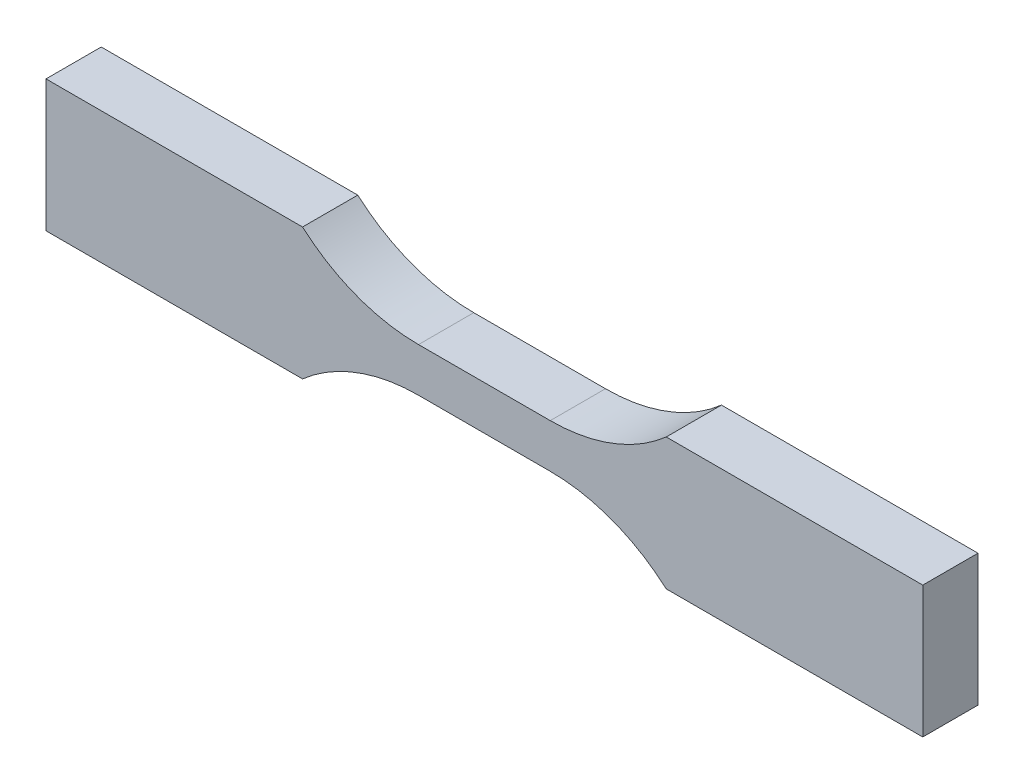
ISO-10303-21;
HEADER;
FILE_DESCRIPTION(('STEP AP214'),'2;1');
FILE_NAME('part.step','',(''),(''),'','','');
FILE_SCHEMA(('AUTOMOTIVE_DESIGN { 1 0 10303 214 1 1 1 1 }'));
ENDSEC;
DATA;
#1=APPLICATION_CONTEXT('core data for automotive mechanical design processes');
#2=APPLICATION_PROTOCOL_DEFINITION('international standard','automotive_design',2000,#1);
#3=PRODUCT_CONTEXT('',#1,'mechanical');
#4=PRODUCT('Part','Part','',(#3));
#5=PRODUCT_RELATED_PRODUCT_CATEGORY('part','',(#4));
#6=PRODUCT_DEFINITION_FORMATION('','',#4);
#7=PRODUCT_DEFINITION_CONTEXT('part definition',#1,'design');
#8=PRODUCT_DEFINITION('design','',#6,#7);
#9=PRODUCT_DEFINITION_SHAPE('','',#8);
#10=(LENGTH_UNIT() NAMED_UNIT(*) SI_UNIT(.MILLI.,.METRE.));
#11=(NAMED_UNIT(*) PLANE_ANGLE_UNIT() SI_UNIT($,.RADIAN.));
#12=(NAMED_UNIT(*) SI_UNIT($,.STERADIAN.) SOLID_ANGLE_UNIT());
#13=UNCERTAINTY_MEASURE_WITH_UNIT(LENGTH_MEASURE(1.E-05),#10,'distance_accuracy_value','');
#14=(GEOMETRIC_REPRESENTATION_CONTEXT(3) GLOBAL_UNCERTAINTY_ASSIGNED_CONTEXT((#13)) GLOBAL_UNIT_ASSIGNED_CONTEXT((#10,
#11,#12)) REPRESENTATION_CONTEXT('',''));
#15=CARTESIAN_POINT('',(0.,0.,0.));
#16=DIRECTION('',(0.,0.,1.));
#17=DIRECTION('',(1.,0.,0.));
#18=AXIS2_PLACEMENT_3D('',#15,#16,#17);
#19=CARTESIAN_POINT('',(18.58,0.,2.));
#20=DIRECTION('',(0.,1.,0.));
#21=DIRECTION('',(0.,0.,1.));
#22=AXIS2_PLACEMENT_3D('',#19,#20,#21);
#23=PLANE('',#22);
#24=DIRECTION('',(1.,0.,0.));
#25=VECTOR('',#24,1.);
#26=CARTESIAN_POINT('',(18.58,0.,-2.));
#27=LINE('',#26,#25);
#28=CARTESIAN_POINT('',(0.,0.,-2.));
#29=VERTEX_POINT('',#28);
#30=CARTESIAN_POINT('',(18.58,0.,-2.));
#31=VERTEX_POINT('',#30);
#32=EDGE_CURVE('E153',#29,#31,#27,.T.);
#33=ORIENTED_EDGE('',*,*,#32,.T.);
#34=DIRECTION('',(0.,0.,-1.));
#35=VECTOR('',#34,1.);
#36=CARTESIAN_POINT('',(18.58,0.,2.));
#37=LINE('',#36,#35);
#38=CARTESIAN_POINT('',(18.58,0.,2.));
#39=VERTEX_POINT('',#38);
#40=EDGE_CURVE('E151',#39,#31,#37,.T.);
#41=ORIENTED_EDGE('',*,*,#40,.F.);
#42=DIRECTION('',(1.,0.,0.));
#43=VECTOR('',#42,1.);
#44=CARTESIAN_POINT('',(18.58,0.,2.));
#45=LINE('',#44,#43);
#46=CARTESIAN_POINT('',(0.,0.,2.));
#47=VERTEX_POINT('',#46);
#48=EDGE_CURVE('E133',#47,#39,#45,.T.);
#49=ORIENTED_EDGE('',*,*,#48,.F.);
#50=DIRECTION('',(0.,0.,-1.));
#51=VECTOR('',#50,1.);
#52=CARTESIAN_POINT('',(0.,0.,2.));
#53=LINE('',#52,#51);
#54=EDGE_CURVE('E210',#47,#29,#53,.T.);
#55=ORIENTED_EDGE('',*,*,#54,.T.);
#56=EDGE_LOOP('',(#33,#41,#49,#55));
#57=FACE_BOUND('',#56,.T.);
#58=ADVANCED_FACE('F45',(#57),#23,.F.);
#59=CARTESIAN_POINT('',(44.92,3.175,2.));
#60=DIRECTION('',(0.,1.,0.));
#61=DIRECTION('',(-1.,0.,0.));
#62=AXIS2_PLACEMENT_3D('',#59,#60,#61);
#63=PLANE('',#62);
#64=DIRECTION('',(1.,0.,0.));
#65=VECTOR('',#64,1.);
#66=CARTESIAN_POINT('',(44.92,3.175,-2.));
#67=LINE('',#66,#65);
#68=CARTESIAN_POINT('',(26.9802604126301,3.175,-2.));
#69=VERTEX_POINT('',#68);
#70=CARTESIAN_POINT('',(36.5197395873699,3.175,-2.));
#71=VERTEX_POINT('',#70);
#72=EDGE_CURVE('E218',#69,#71,#67,.T.);
#73=ORIENTED_EDGE('',*,*,#72,.T.);
#74=DIRECTION('',(0.,0.,1.));
#75=VECTOR('',#74,1.);
#76=CARTESIAN_POINT('',(36.5197395873699,3.175,2.));
#77=LINE('',#76,#75);
#78=CARTESIAN_POINT('',(36.5197395873699,3.175,2.));
#79=VERTEX_POINT('',#78);
#80=EDGE_CURVE('E258',#71,#79,#77,.T.);
#81=ORIENTED_EDGE('',*,*,#80,.T.);
#82=DIRECTION('',(1.,0.,0.));
#83=VECTOR('',#82,1.);
#84=CARTESIAN_POINT('',(44.92,3.175,2.));
#85=LINE('',#84,#83);
#86=CARTESIAN_POINT('',(26.9802604126301,3.175,2.));
#87=VERTEX_POINT('',#86);
#88=EDGE_CURVE('E146',#87,#79,#85,.T.);
#89=ORIENTED_EDGE('',*,*,#88,.F.);
#90=DIRECTION('',(0.,0.,-1.));
#91=VECTOR('',#90,1.);
#92=CARTESIAN_POINT('',(26.9802604126301,3.175,2.));
#93=LINE('',#92,#91);
#94=EDGE_CURVE('E156',#87,#69,#93,.T.);
#95=ORIENTED_EDGE('',*,*,#94,.T.);
#96=EDGE_LOOP('',(#73,#81,#89,#95));
#97=FACE_BOUND('',#96,.T.);
#98=ADVANCED_FACE('F282',(#97),#63,.F.);
#99=CARTESIAN_POINT('',(63.5,0.,2.));
#100=DIRECTION('',(0.,1.,0.));
#101=DIRECTION('',(-1.,0.,0.));
#102=AXIS2_PLACEMENT_3D('',#99,#100,#101);
#103=PLANE('',#102);
#104=DIRECTION('',(1.,0.,0.));
#105=VECTOR('',#104,1.);
#106=CARTESIAN_POINT('',(63.5,0.,-2.));
#107=LINE('',#106,#105);
#108=CARTESIAN_POINT('',(44.92,0.,-2.));
#109=VERTEX_POINT('',#108);
#110=CARTESIAN_POINT('',(63.5,0.,-2.));
#111=VERTEX_POINT('',#110);
#112=EDGE_CURVE('E222',#109,#111,#107,.T.);
#113=ORIENTED_EDGE('',*,*,#112,.T.);
#114=DIRECTION('',(0.,0.,-1.));
#115=VECTOR('',#114,1.);
#116=CARTESIAN_POINT('',(63.5,0.,2.));
#117=LINE('',#116,#115);
#118=CARTESIAN_POINT('',(63.5,0.,2.));
#119=VERTEX_POINT('',#118);
#120=EDGE_CURVE('E249',#119,#111,#117,.T.);
#121=ORIENTED_EDGE('',*,*,#120,.F.);
#122=DIRECTION('',(1.,0.,0.));
#123=VECTOR('',#122,1.);
#124=CARTESIAN_POINT('',(63.5,0.,2.));
#125=LINE('',#124,#123);
#126=CARTESIAN_POINT('',(44.92,0.,2.));
#127=VERTEX_POINT('',#126);
#128=EDGE_CURVE('E266',#127,#119,#125,.T.);
#129=ORIENTED_EDGE('',*,*,#128,.F.);
#130=DIRECTION('',(0.,0.,-1.));
#131=VECTOR('',#130,1.);
#132=CARTESIAN_POINT('',(44.92,0.,2.));
#133=LINE('',#132,#131);
#134=EDGE_CURVE('E157',#127,#109,#133,.T.);
#135=ORIENTED_EDGE('',*,*,#134,.T.);
#136=EDGE_LOOP('',(#113,#121,#129,#135));
#137=FACE_BOUND('',#136,.T.);
#138=ADVANCED_FACE('F272',(#137),#103,.F.);
#139=CARTESIAN_POINT('',(63.5,9.53,2.));
#140=DIRECTION('',(-1.,0.,0.));
#141=DIRECTION('',(0.,0.,1.));
#142=AXIS2_PLACEMENT_3D('',#139,#140,#141);
#143=PLANE('',#142);
#144=DIRECTION('',(0.,1.,0.));
#145=VECTOR('',#144,1.);
#146=CARTESIAN_POINT('',(63.5,9.53,-2.));
#147=LINE('',#146,#145);
#148=CARTESIAN_POINT('',(63.5,9.53,-2.));
#149=VERTEX_POINT('',#148);
#150=EDGE_CURVE('E225',#111,#149,#147,.T.);
#151=ORIENTED_EDGE('',*,*,#150,.T.);
#152=DIRECTION('',(0.,0.,-1.));
#153=VECTOR('',#152,1.);
#154=CARTESIAN_POINT('',(63.5,9.53,2.));
#155=LINE('',#154,#153);
#156=CARTESIAN_POINT('',(63.5,9.53,2.));
#157=VERTEX_POINT('',#156);
#158=EDGE_CURVE('E245',#157,#149,#155,.T.);
#159=ORIENTED_EDGE('',*,*,#158,.F.);
#160=DIRECTION('',(0.,1.,0.));
#161=VECTOR('',#160,1.);
#162=CARTESIAN_POINT('',(63.5,9.53,2.));
#163=LINE('',#162,#161);
#164=EDGE_CURVE('E276',#119,#157,#163,.T.);
#165=ORIENTED_EDGE('',*,*,#164,.F.);
#166=ORIENTED_EDGE('',*,*,#120,.T.);
#167=EDGE_LOOP('',(#151,#159,#165,#166));
#168=FACE_BOUND('',#167,.T.);
#169=ADVANCED_FACE('F297',(#168),#143,.F.);
#170=CARTESIAN_POINT('',(44.92,9.53,2.));
#171=DIRECTION('',(0.,-1.,0.));
#172=DIRECTION('',(0.,0.,-1.));
#173=AXIS2_PLACEMENT_3D('',#170,#171,#172);
#174=PLANE('',#173);
#175=DIRECTION('',(-1.,0.,0.));
#176=VECTOR('',#175,1.);
#177=CARTESIAN_POINT('',(44.92,9.53,-2.));
#178=LINE('',#177,#176);
#179=CARTESIAN_POINT('',(44.92,9.53,-2.));
#180=VERTEX_POINT('',#179);
#181=EDGE_CURVE('E194',#149,#180,#178,.T.);
#182=ORIENTED_EDGE('',*,*,#181,.T.);
#183=DIRECTION('',(0.,0.,-1.));
#184=VECTOR('',#183,1.);
#185=CARTESIAN_POINT('',(44.92,9.53,2.));
#186=LINE('',#185,#184);
#187=CARTESIAN_POINT('',(44.92,9.53,2.));
#188=VERTEX_POINT('',#187);
#189=EDGE_CURVE('E241',#188,#180,#186,.T.);
#190=ORIENTED_EDGE('',*,*,#189,.F.);
#191=DIRECTION('',(-1.,0.,0.));
#192=VECTOR('',#191,1.);
#193=CARTESIAN_POINT('',(44.92,9.53,2.));
#194=LINE('',#193,#192);
#195=EDGE_CURVE('E212',#157,#188,#194,.T.);
#196=ORIENTED_EDGE('',*,*,#195,.F.);
#197=ORIENTED_EDGE('',*,*,#158,.T.);
#198=EDGE_LOOP('',(#182,#190,#196,#197));
#199=FACE_BOUND('',#198,.T.);
#200=ADVANCED_FACE('F292',(#199),#174,.F.);
#201=CARTESIAN_POINT('',(18.58,6.355,2.));
#202=DIRECTION('',(0.,-1.,0.));
#203=DIRECTION('',(0.,0.,-1.));
#204=AXIS2_PLACEMENT_3D('',#201,#202,#203);
#205=PLANE('',#204);
#206=DIRECTION('',(-1.,0.,0.));
#207=VECTOR('',#206,1.);
#208=CARTESIAN_POINT('',(18.58,6.355,2.));
#209=LINE('',#208,#207);
#210=CARTESIAN_POINT('',(36.5197395873699,6.355,2.));
#211=VERTEX_POINT('',#210);
#212=CARTESIAN_POINT('',(26.9802604126301,6.355,2.));
#213=VERTEX_POINT('',#212);
#214=EDGE_CURVE('E201',#211,#213,#209,.T.);
#215=ORIENTED_EDGE('',*,*,#214,.F.);
#216=DIRECTION('',(0.,0.,-1.));
#217=VECTOR('',#216,1.);
#218=CARTESIAN_POINT('',(36.5197395873699,6.355,2.));
#219=LINE('',#218,#217);
#220=CARTESIAN_POINT('',(36.5197395873699,6.355,-2.));
#221=VERTEX_POINT('',#220);
#222=EDGE_CURVE('E167',#211,#221,#219,.T.);
#223=ORIENTED_EDGE('',*,*,#222,.T.);
#224=DIRECTION('',(-1.,0.,0.));
#225=VECTOR('',#224,1.);
#226=CARTESIAN_POINT('',(18.58,6.355,-2.));
#227=LINE('',#226,#225);
#228=CARTESIAN_POINT('',(26.9802604126301,6.355,-2.));
#229=VERTEX_POINT('',#228);
#230=EDGE_CURVE('E185',#221,#229,#227,.T.);
#231=ORIENTED_EDGE('',*,*,#230,.T.);
#232=DIRECTION('',(0.,0.,1.));
#233=VECTOR('',#232,1.);
#234=CARTESIAN_POINT('',(26.9802604126301,6.355,2.));
#235=LINE('',#234,#233);
#236=EDGE_CURVE('E61',#229,#213,#235,.T.);
#237=ORIENTED_EDGE('',*,*,#236,.T.);
#238=EDGE_LOOP('',(#215,#223,#231,#237));
#239=FACE_BOUND('',#238,.T.);
#240=ADVANCED_FACE('F191',(#239),#205,.F.);
#241=CARTESIAN_POINT('',(0.,9.53,2.));
#242=DIRECTION('',(0.,-1.,0.));
#243=DIRECTION('',(0.,0.,-1.));
#244=AXIS2_PLACEMENT_3D('',#241,#242,#243);
#245=PLANE('',#244);
#246=DIRECTION('',(-1.,0.,0.));
#247=VECTOR('',#246,1.);
#248=CARTESIAN_POINT('',(0.,9.53,-2.));
#249=LINE('',#248,#247);
#250=CARTESIAN_POINT('',(18.58,9.53,-2.));
#251=VERTEX_POINT('',#250);
#252=CARTESIAN_POINT('',(0.,9.53,-2.));
#253=VERTEX_POINT('',#252);
#254=EDGE_CURVE('E187',#251,#253,#249,.T.);
#255=ORIENTED_EDGE('',*,*,#254,.T.);
#256=DIRECTION('',(0.,0.,-1.));
#257=VECTOR('',#256,1.);
#258=CARTESIAN_POINT('',(0.,9.53,2.));
#259=LINE('',#258,#257);
#260=CARTESIAN_POINT('',(0.,9.53,2.));
#261=VERTEX_POINT('',#260);
#262=EDGE_CURVE('E205',#261,#253,#259,.T.);
#263=ORIENTED_EDGE('',*,*,#262,.F.);
#264=DIRECTION('',(-1.,0.,0.));
#265=VECTOR('',#264,1.);
#266=CARTESIAN_POINT('',(0.,9.53,2.));
#267=LINE('',#266,#265);
#268=CARTESIAN_POINT('',(18.58,9.53,2.));
#269=VERTEX_POINT('',#268);
#270=EDGE_CURVE('E199',#269,#261,#267,.T.);
#271=ORIENTED_EDGE('',*,*,#270,.F.);
#272=DIRECTION('',(0.,0.,-1.));
#273=VECTOR('',#272,1.);
#274=CARTESIAN_POINT('',(18.58,9.53,2.));
#275=LINE('',#274,#273);
#276=EDGE_CURVE('E197',#269,#251,#275,.T.);
#277=ORIENTED_EDGE('',*,*,#276,.T.);
#278=EDGE_LOOP('',(#255,#263,#271,#277));
#279=FACE_BOUND('',#278,.T.);
#280=ADVANCED_FACE('F203',(#279),#245,.F.);
#281=CARTESIAN_POINT('',(0.,0.,2.));
#282=DIRECTION('',(1.,0.,0.));
#283=DIRECTION('',(0.,0.,-1.));
#284=AXIS2_PLACEMENT_3D('',#281,#282,#283);
#285=PLANE('',#284);
#286=DIRECTION('',(0.,-1.,0.));
#287=VECTOR('',#286,1.);
#288=CARTESIAN_POINT('',(0.,0.,-2.));
#289=LINE('',#288,#287);
#290=EDGE_CURVE('E147',#253,#29,#289,.T.);
#291=ORIENTED_EDGE('',*,*,#290,.T.);
#292=ORIENTED_EDGE('',*,*,#54,.F.);
#293=DIRECTION('',(0.,-1.,0.));
#294=VECTOR('',#293,1.);
#295=CARTESIAN_POINT('',(0.,0.,2.));
#296=LINE('',#295,#294);
#297=EDGE_CURVE('E141',#261,#47,#296,.T.);
#298=ORIENTED_EDGE('',*,*,#297,.F.);
#299=ORIENTED_EDGE('',*,*,#262,.T.);
#300=EDGE_LOOP('',(#291,#292,#298,#299));
#301=FACE_BOUND('',#300,.T.);
#302=ADVANCED_FACE('F357',(#301),#285,.F.);
#303=CARTESIAN_POINT('',(0.,0.,2.));
#304=DIRECTION('',(0.,0.,-1.));
#305=DIRECTION('',(-1.,0.,0.));
#306=AXIS2_PLACEMENT_3D('',#303,#304,#305);
#307=PLANE('',#306);
#308=ORIENTED_EDGE('',*,*,#48,.T.);
#309=CARTESIAN_POINT('',(26.9802604126301,-9.525,2.));
#310=DIRECTION('',(0.,0.,-1.));
#311=DIRECTION('',(-1.,0.,0.));
#312=AXIS2_PLACEMENT_3D('',#309,#310,#311);
#313=CIRCLE('',#312,12.7);
#314=EDGE_CURVE('E138',#39,#87,#313,.T.);
#315=ORIENTED_EDGE('',*,*,#314,.T.);
#316=ORIENTED_EDGE('',*,*,#88,.T.);
#317=CARTESIAN_POINT('',(36.5197395873699,-9.525,2.));
#318=DIRECTION('',(0.,0.,-1.));
#319=DIRECTION('',(-1.,0.,0.));
#320=AXIS2_PLACEMENT_3D('',#317,#318,#319);
#321=CIRCLE('',#320,12.7);
#322=EDGE_CURVE('E169',#79,#127,#321,.T.);
#323=ORIENTED_EDGE('',*,*,#322,.T.);
#324=ORIENTED_EDGE('',*,*,#128,.T.);
#325=ORIENTED_EDGE('',*,*,#164,.T.);
#326=ORIENTED_EDGE('',*,*,#195,.T.);
#327=CARTESIAN_POINT('',(36.5197395873699,19.055,2.));
#328=DIRECTION('',(0.,0.,-1.));
#329=DIRECTION('',(-1.,0.,0.));
#330=AXIS2_PLACEMENT_3D('',#327,#328,#329);
#331=CIRCLE('',#330,12.7);
#332=EDGE_CURVE('E68',#188,#211,#331,.T.);
#333=ORIENTED_EDGE('',*,*,#332,.T.);
#334=ORIENTED_EDGE('',*,*,#214,.T.);
#335=CARTESIAN_POINT('',(26.9802604126301,19.055,2.));
#336=DIRECTION('',(0.,0.,-1.));
#337=DIRECTION('',(-1.,0.,0.));
#338=AXIS2_PLACEMENT_3D('',#335,#336,#337);
#339=CIRCLE('',#338,12.7);
#340=EDGE_CURVE('E11',#213,#269,#339,.T.);
#341=ORIENTED_EDGE('',*,*,#340,.T.);
#342=ORIENTED_EDGE('',*,*,#270,.T.);
#343=ORIENTED_EDGE('',*,*,#297,.T.);
#344=EDGE_LOOP('',(#308,#315,#316,#323,#324,#325,#326,#333,#334,#341,#342,#343));
#345=FACE_BOUND('',#344,.T.);
#346=ADVANCED_FACE('F135',(#345),#307,.F.);
#347=CARTESIAN_POINT('',(0.,0.,-2.));
#348=DIRECTION('',(0.,0.,-1.));
#349=DIRECTION('',(-1.,0.,0.));
#350=AXIS2_PLACEMENT_3D('',#347,#348,#349);
#351=PLANE('',#350);
#352=ORIENTED_EDGE('',*,*,#32,.F.);
#353=ORIENTED_EDGE('',*,*,#290,.F.);
#354=ORIENTED_EDGE('',*,*,#254,.F.);
#355=CARTESIAN_POINT('',(26.9802604126301,19.055,-2.));
#356=DIRECTION('',(0.,0.,-1.));
#357=DIRECTION('',(-1.,0.,0.));
#358=AXIS2_PLACEMENT_3D('',#355,#356,#357);
#359=CIRCLE('',#358,12.7);
#360=EDGE_CURVE('E54',#251,#229,#359,.F.);
#361=ORIENTED_EDGE('',*,*,#360,.T.);
#362=ORIENTED_EDGE('',*,*,#230,.F.);
#363=CARTESIAN_POINT('',(36.5197395873699,19.055,-2.));
#364=DIRECTION('',(0.,0.,-1.));
#365=DIRECTION('',(-1.,0.,0.));
#366=AXIS2_PLACEMENT_3D('',#363,#364,#365);
#367=CIRCLE('',#366,12.7);
#368=EDGE_CURVE('E176',#221,#180,#367,.F.);
#369=ORIENTED_EDGE('',*,*,#368,.T.);
#370=ORIENTED_EDGE('',*,*,#181,.F.);
#371=ORIENTED_EDGE('',*,*,#150,.F.);
#372=ORIENTED_EDGE('',*,*,#112,.F.);
#373=CARTESIAN_POINT('',(36.5197395873699,-9.525,-2.));
#374=DIRECTION('',(0.,0.,-1.));
#375=DIRECTION('',(-1.,0.,0.));
#376=AXIS2_PLACEMENT_3D('',#373,#374,#375);
#377=CIRCLE('',#376,12.7);
#378=EDGE_CURVE('E261',#109,#71,#377,.F.);
#379=ORIENTED_EDGE('',*,*,#378,.T.);
#380=ORIENTED_EDGE('',*,*,#72,.F.);
#381=CARTESIAN_POINT('',(26.9802604126301,-9.525,-2.));
#382=DIRECTION('',(0.,0.,-1.));
#383=DIRECTION('',(-1.,0.,0.));
#384=AXIS2_PLACEMENT_3D('',#381,#382,#383);
#385=CIRCLE('',#384,12.7);
#386=EDGE_CURVE('E163',#69,#31,#385,.F.);
#387=ORIENTED_EDGE('',*,*,#386,.T.);
#388=EDGE_LOOP('',(#352,#353,#354,#361,#362,#369,#370,#371,#372,#379,#380,#387));
#389=FACE_BOUND('',#388,.T.);
#390=ADVANCED_FACE('F184',(#389),#351,.T.);
#391=CARTESIAN_POINT('',(36.5197395873699,-9.525,2.));
#392=DIRECTION('',(0.,0.,1.));
#393=DIRECTION('',(1.,0.,0.));
#394=AXIS2_PLACEMENT_3D('',#391,#392,#393);
#395=CYLINDRICAL_SURFACE('',#394,12.7);
#396=ORIENTED_EDGE('',*,*,#322,.F.);
#397=ORIENTED_EDGE('',*,*,#80,.F.);
#398=ORIENTED_EDGE('',*,*,#378,.F.);
#399=ORIENTED_EDGE('',*,*,#134,.F.);
#400=EDGE_LOOP('',(#396,#397,#398,#399));
#401=FACE_BOUND('',#400,.T.);
#402=ADVANCED_FACE('F278',(#401),#395,.F.);
#403=CARTESIAN_POINT('',(26.9802604126301,-9.525,2.));
#404=DIRECTION('',(0.,0.,-1.));
#405=DIRECTION('',(-1.,0.,0.));
#406=AXIS2_PLACEMENT_3D('',#403,#404,#405);
#407=CYLINDRICAL_SURFACE('',#406,12.7);
#408=ORIENTED_EDGE('',*,*,#314,.F.);
#409=ORIENTED_EDGE('',*,*,#40,.T.);
#410=ORIENTED_EDGE('',*,*,#386,.F.);
#411=ORIENTED_EDGE('',*,*,#94,.F.);
#412=EDGE_LOOP('',(#408,#409,#410,#411));
#413=FACE_BOUND('',#412,.T.);
#414=ADVANCED_FACE('F160',(#413),#407,.F.);
#415=CARTESIAN_POINT('',(36.5197395873699,19.055,2.));
#416=DIRECTION('',(0.,0.,-1.));
#417=DIRECTION('',(-1.,0.,0.));
#418=AXIS2_PLACEMENT_3D('',#415,#416,#417);
#419=CYLINDRICAL_SURFACE('',#418,12.7);
#420=ORIENTED_EDGE('',*,*,#332,.F.);
#421=ORIENTED_EDGE('',*,*,#189,.T.);
#422=ORIENTED_EDGE('',*,*,#368,.F.);
#423=ORIENTED_EDGE('',*,*,#222,.F.);
#424=EDGE_LOOP('',(#420,#421,#422,#423));
#425=FACE_BOUND('',#424,.T.);
#426=ADVANCED_FACE('F295',(#425),#419,.F.);
#427=CARTESIAN_POINT('',(26.9802604126301,19.055,2.));
#428=DIRECTION('',(0.,0.,1.));
#429=DIRECTION('',(1.,0.,0.));
#430=AXIS2_PLACEMENT_3D('',#427,#428,#429);
#431=CYLINDRICAL_SURFACE('',#430,12.7);
#432=ORIENTED_EDGE('',*,*,#340,.F.);
#433=ORIENTED_EDGE('',*,*,#236,.F.);
#434=ORIENTED_EDGE('',*,*,#360,.F.);
#435=ORIENTED_EDGE('',*,*,#276,.F.);
#436=EDGE_LOOP('',(#432,#433,#434,#435));
#437=FACE_BOUND('',#436,.T.);
#438=ADVANCED_FACE('F47',(#437),#431,.F.);
#439=CLOSED_SHELL('',(#58,#98,#138,#169,#200,#240,#280,#302,#346,#390,#402,#414,#426,#438));
#440=MANIFOLD_SOLID_BREP('B2',#439);
#441=ADVANCED_BREP_SHAPE_REPRESENTATION('',(#18,#440),#14);
#442=SHAPE_DEFINITION_REPRESENTATION(#9,#441);
ENDSEC;
END-ISO-10303-21;
